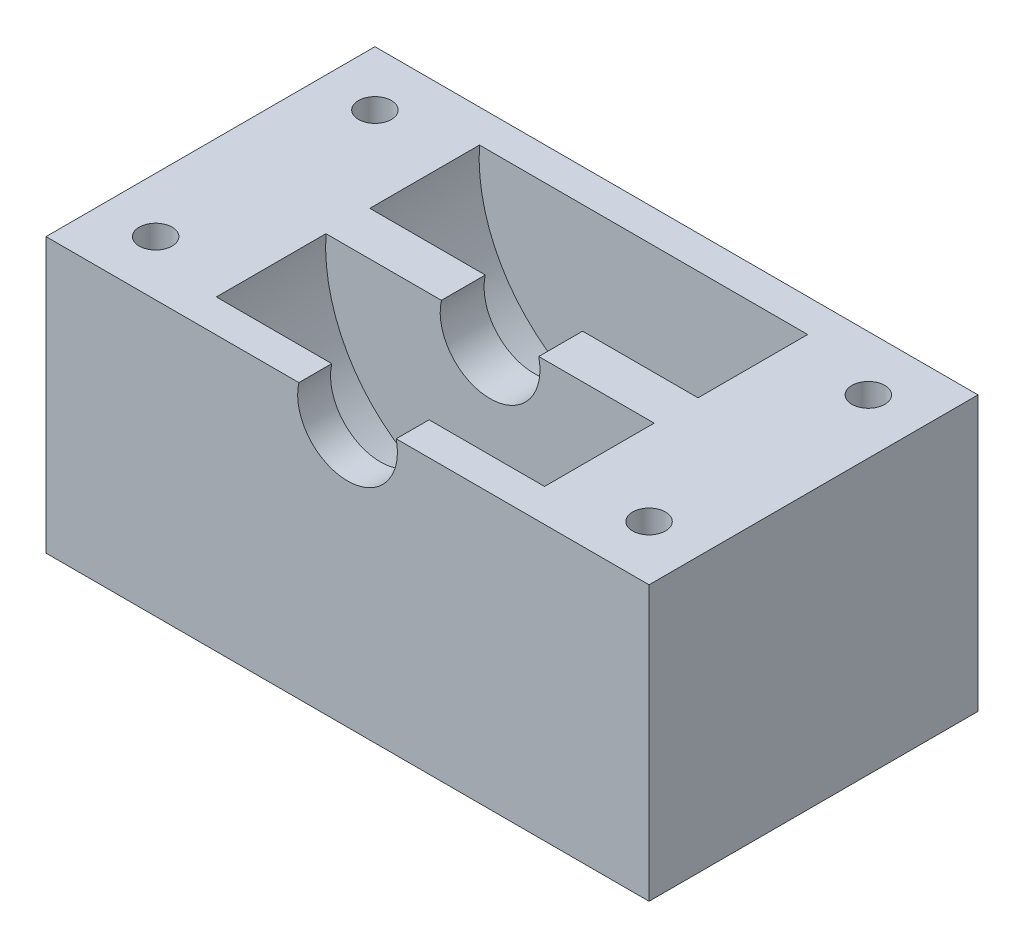
ISO-10303-21;
HEADER;
FILE_DESCRIPTION(('STEP AP214'),'2;1');
FILE_NAME('part.step','',(''),(''),'','','');
FILE_SCHEMA(('AUTOMOTIVE_DESIGN { 1 0 10303 214 1 1 1 1 }'));
ENDSEC;
DATA;
#1=APPLICATION_CONTEXT('core data for automotive mechanical design processes');
#2=APPLICATION_PROTOCOL_DEFINITION('international standard','automotive_design',2000,#1);
#3=PRODUCT_CONTEXT('',#1,'mechanical');
#4=PRODUCT('Part','Part','',(#3));
#5=PRODUCT_RELATED_PRODUCT_CATEGORY('part','',(#4));
#6=PRODUCT_DEFINITION_FORMATION('','',#4);
#7=PRODUCT_DEFINITION_CONTEXT('part definition',#1,'design');
#8=PRODUCT_DEFINITION('design','',#6,#7);
#9=PRODUCT_DEFINITION_SHAPE('','',#8);
#10=(LENGTH_UNIT() NAMED_UNIT(*) SI_UNIT(.MILLI.,.METRE.));
#11=(NAMED_UNIT(*) PLANE_ANGLE_UNIT() SI_UNIT($,.RADIAN.));
#12=(NAMED_UNIT(*) SI_UNIT($,.STERADIAN.) SOLID_ANGLE_UNIT());
#13=UNCERTAINTY_MEASURE_WITH_UNIT(LENGTH_MEASURE(1.E-05),#10,'distance_accuracy_value','');
#14=(GEOMETRIC_REPRESENTATION_CONTEXT(3) GLOBAL_UNCERTAINTY_ASSIGNED_CONTEXT((#13)) GLOBAL_UNIT_ASSIGNED_CONTEXT((#10,
#11,#12)) REPRESENTATION_CONTEXT('',''));
#15=CARTESIAN_POINT('',(0.,0.,0.));
#16=DIRECTION('',(0.,0.,1.));
#17=DIRECTION('',(1.,0.,0.));
#18=AXIS2_PLACEMENT_3D('',#15,#16,#17);
#19=CARTESIAN_POINT('',(-22.5,-17.5,15.));
#20=DIRECTION('',(0.,1.,0.));
#21=DIRECTION('',(0.,0.,-1.));
#22=AXIS2_PLACEMENT_3D('',#19,#20,#21);
#23=CYLINDRICAL_SURFACE('',#22,1.5);
#24=CARTESIAN_POINT('',(-22.5,0.999999999999994,15.));
#25=DIRECTION('',(0.,1.,0.));
#26=DIRECTION('',(0.,0.,1.));
#27=AXIS2_PLACEMENT_3D('',#24,#25,#26);
#28=CIRCLE('',#27,1.5);
#29=CARTESIAN_POINT('',(-22.5,0.999999999999994,16.5));
#30=VERTEX_POINT('',#29);
#31=EDGE_CURVE('E161',#30,#30,#28,.F.);
#32=ORIENTED_EDGE('',*,*,#31,.F.);
#33=EDGE_LOOP('',(#32));
#34=FACE_BOUND('',#33,.T.);
#35=CARTESIAN_POINT('',(-22.5,-4.,15.));
#36=DIRECTION('',(0.,1.,0.));
#37=DIRECTION('',(0.,0.,1.));
#38=AXIS2_PLACEMENT_3D('',#35,#36,#37);
#39=CIRCLE('',#38,1.5);
#40=CARTESIAN_POINT('',(-22.5,-4.,16.5));
#41=VERTEX_POINT('',#40);
#42=EDGE_CURVE('E43',#41,#41,#39,.F.);
#43=ORIENTED_EDGE('',*,*,#42,.T.);
#44=EDGE_LOOP('',(#43));
#45=FACE_BOUND('',#44,.T.);
#46=ADVANCED_FACE('F39',(#34,#45),#23,.F.);
#47=CARTESIAN_POINT('',(-22.5,-17.5,-5.));
#48=DIRECTION('',(0.,1.,0.));
#49=DIRECTION('',(0.,0.,-1.));
#50=AXIS2_PLACEMENT_3D('',#47,#48,#49);
#51=CYLINDRICAL_SURFACE('',#50,1.5);
#52=CARTESIAN_POINT('',(-22.5,0.999999999999994,-5.));
#53=DIRECTION('',(0.,1.,0.));
#54=DIRECTION('',(0.,0.,1.));
#55=AXIS2_PLACEMENT_3D('',#52,#53,#54);
#56=CIRCLE('',#55,1.5);
#57=CARTESIAN_POINT('',(-22.5,0.999999999999994,-3.5));
#58=VERTEX_POINT('',#57);
#59=EDGE_CURVE('E158',#58,#58,#56,.F.);
#60=ORIENTED_EDGE('',*,*,#59,.F.);
#61=EDGE_LOOP('',(#60));
#62=FACE_BOUND('',#61,.T.);
#63=CARTESIAN_POINT('',(-22.5,-4.,-5.));
#64=DIRECTION('',(0.,1.,0.));
#65=DIRECTION('',(0.,0.,1.));
#66=AXIS2_PLACEMENT_3D('',#63,#64,#65);
#67=CIRCLE('',#66,1.5);
#68=CARTESIAN_POINT('',(-22.5,-4.,-3.5));
#69=VERTEX_POINT('',#68);
#70=EDGE_CURVE('E239',#69,#69,#67,.F.);
#71=ORIENTED_EDGE('',*,*,#70,.T.);
#72=EDGE_LOOP('',(#71));
#73=FACE_BOUND('',#72,.T.);
#74=ADVANCED_FACE('F265',(#62,#73),#51,.F.);
#75=CARTESIAN_POINT('',(22.5,-17.5,-5.));
#76=DIRECTION('',(0.,1.,0.));
#77=DIRECTION('',(0.,0.,-1.));
#78=AXIS2_PLACEMENT_3D('',#75,#76,#77);
#79=CYLINDRICAL_SURFACE('',#78,1.5);
#80=CARTESIAN_POINT('',(22.5,0.999999999999994,-5.));
#81=DIRECTION('',(0.,1.,0.));
#82=DIRECTION('',(0.,0.,1.));
#83=AXIS2_PLACEMENT_3D('',#80,#81,#82);
#84=CIRCLE('',#83,1.5);
#85=CARTESIAN_POINT('',(22.5,0.999999999999994,-3.5));
#86=VERTEX_POINT('',#85);
#87=EDGE_CURVE('E155',#86,#86,#84,.F.);
#88=ORIENTED_EDGE('',*,*,#87,.F.);
#89=EDGE_LOOP('',(#88));
#90=FACE_BOUND('',#89,.T.);
#91=CARTESIAN_POINT('',(22.5,-4.,-5.));
#92=DIRECTION('',(0.,1.,0.));
#93=DIRECTION('',(0.,0.,1.));
#94=AXIS2_PLACEMENT_3D('',#91,#92,#93);
#95=CIRCLE('',#94,1.5);
#96=CARTESIAN_POINT('',(22.5,-4.,-3.5));
#97=VERTEX_POINT('',#96);
#98=EDGE_CURVE('E236',#97,#97,#95,.F.);
#99=ORIENTED_EDGE('',*,*,#98,.T.);
#100=EDGE_LOOP('',(#99));
#101=FACE_BOUND('',#100,.T.);
#102=ADVANCED_FACE('F271',(#90,#101),#79,.F.);
#103=CARTESIAN_POINT('',(22.5,-17.5,15.));
#104=DIRECTION('',(0.,1.,0.));
#105=DIRECTION('',(0.,0.,-1.));
#106=AXIS2_PLACEMENT_3D('',#103,#104,#105);
#107=CYLINDRICAL_SURFACE('',#106,1.5);
#108=CARTESIAN_POINT('',(22.5,0.999999999999994,15.));
#109=DIRECTION('',(0.,1.,0.));
#110=DIRECTION('',(0.,0.,1.));
#111=AXIS2_PLACEMENT_3D('',#108,#109,#110);
#112=CIRCLE('',#111,1.5);
#113=CARTESIAN_POINT('',(22.5,0.999999999999994,16.5));
#114=VERTEX_POINT('',#113);
#115=EDGE_CURVE('E152',#114,#114,#112,.F.);
#116=ORIENTED_EDGE('',*,*,#115,.F.);
#117=EDGE_LOOP('',(#116));
#118=FACE_BOUND('',#117,.T.);
#119=CARTESIAN_POINT('',(22.5,-4.,15.));
#120=DIRECTION('',(0.,1.,0.));
#121=DIRECTION('',(0.,0.,1.));
#122=AXIS2_PLACEMENT_3D('',#119,#120,#121);
#123=CIRCLE('',#122,1.5);
#124=CARTESIAN_POINT('',(22.5,-4.,16.5));
#125=VERTEX_POINT('',#124);
#126=EDGE_CURVE('E233',#125,#125,#123,.F.);
#127=ORIENTED_EDGE('',*,*,#126,.T.);
#128=EDGE_LOOP('',(#127));
#129=FACE_BOUND('',#128,.T.);
#130=ADVANCED_FACE('F277',(#118,#129),#107,.F.);
#131=CARTESIAN_POINT('',(0.,0.,-10.));
#132=DIRECTION('',(0.,0.,1.));
#133=DIRECTION('',(-1.,0.,0.));
#134=AXIS2_PLACEMENT_3D('',#131,#132,#133);
#135=CYLINDRICAL_SURFACE('',#134,15.);
#136=DIRECTION('',(0.,0.,1.));
#137=VECTOR('',#136,1.);
#138=CARTESIAN_POINT('',(-14.9666295470958,0.999999999999994,-10.));
#139=LINE('',#138,#137);
#140=CARTESIAN_POINT('',(-14.9666295470958,0.999999999999994,-7.));
#141=VERTEX_POINT('',#140);
#142=CARTESIAN_POINT('',(-14.9666295470958,0.999999999999994,3.));
#143=VERTEX_POINT('',#142);
#144=EDGE_CURVE('E187',#141,#143,#139,.T.);
#145=ORIENTED_EDGE('',*,*,#144,.T.);
#146=CARTESIAN_POINT('',(0.,0.,3.));
#147=DIRECTION('',(0.,0.,1.));
#148=DIRECTION('',(1.,0.,0.));
#149=AXIS2_PLACEMENT_3D('',#146,#147,#148);
#150=CIRCLE('',#149,15.);
#151=CARTESIAN_POINT('',(14.9666295470958,0.999999999999994,3.));
#152=VERTEX_POINT('',#151);
#153=EDGE_CURVE('E215',#143,#152,#150,.T.);
#154=ORIENTED_EDGE('',*,*,#153,.T.);
#155=DIRECTION('',(0.,0.,1.));
#156=VECTOR('',#155,1.);
#157=CARTESIAN_POINT('',(14.9666295470958,0.999999999999994,-10.));
#158=LINE('',#157,#156);
#159=CARTESIAN_POINT('',(14.9666295470958,0.999999999999994,-7.));
#160=VERTEX_POINT('',#159);
#161=EDGE_CURVE('E181',#152,#160,#158,.F.);
#162=ORIENTED_EDGE('',*,*,#161,.T.);
#163=CARTESIAN_POINT('',(0.,0.,-7.));
#164=DIRECTION('',(0.,0.,1.));
#165=DIRECTION('',(1.,0.,0.));
#166=AXIS2_PLACEMENT_3D('',#163,#164,#165);
#167=CIRCLE('',#166,15.);
#168=EDGE_CURVE('E202',#141,#160,#167,.T.);
#169=ORIENTED_EDGE('',*,*,#168,.F.);
#170=EDGE_LOOP('',(#145,#154,#162,#169));
#171=FACE_BOUND('',#170,.T.);
#172=ADVANCED_FACE('F286',(#171),#135,.F.);
#173=CARTESIAN_POINT('',(0.,0.,20.));
#174=DIRECTION('',(0.,0.,-1.));
#175=DIRECTION('',(1.,0.,0.));
#176=AXIS2_PLACEMENT_3D('',#173,#174,#175);
#177=CYLINDRICAL_SURFACE('',#176,15.);
#178=DIRECTION('',(0.,0.,-1.));
#179=VECTOR('',#178,1.);
#180=CARTESIAN_POINT('',(14.9666295470958,0.999999999999994,20.));
#181=LINE('',#180,#179);
#182=CARTESIAN_POINT('',(14.9666295470958,0.999999999999994,17.));
#183=VERTEX_POINT('',#182);
#184=CARTESIAN_POINT('',(14.9666295470958,0.999999999999994,7.));
#185=VERTEX_POINT('',#184);
#186=EDGE_CURVE('E169',#183,#185,#181,.T.);
#187=ORIENTED_EDGE('',*,*,#186,.T.);
#188=CARTESIAN_POINT('',(0.,0.,7.));
#189=DIRECTION('',(0.,0.,-1.));
#190=DIRECTION('',(-1.,0.,0.));
#191=AXIS2_PLACEMENT_3D('',#188,#189,#190);
#192=CIRCLE('',#191,15.);
#193=CARTESIAN_POINT('',(-14.9666295470958,0.999999999999994,7.));
#194=VERTEX_POINT('',#193);
#195=EDGE_CURVE('E219',#185,#194,#192,.T.);
#196=ORIENTED_EDGE('',*,*,#195,.T.);
#197=DIRECTION('',(0.,0.,-1.));
#198=VECTOR('',#197,1.);
#199=CARTESIAN_POINT('',(-14.9666295470958,0.999999999999994,20.));
#200=LINE('',#199,#198);
#201=CARTESIAN_POINT('',(-14.9666295470958,0.999999999999994,17.));
#202=VERTEX_POINT('',#201);
#203=EDGE_CURVE('E193',#194,#202,#200,.F.);
#204=ORIENTED_EDGE('',*,*,#203,.T.);
#205=CARTESIAN_POINT('',(0.,0.,17.));
#206=DIRECTION('',(0.,0.,-1.));
#207=DIRECTION('',(-1.,0.,0.));
#208=AXIS2_PLACEMENT_3D('',#205,#206,#207);
#209=CIRCLE('',#208,15.);
#210=EDGE_CURVE('E205',#183,#202,#209,.T.);
#211=ORIENTED_EDGE('',*,*,#210,.F.);
#212=EDGE_LOOP('',(#187,#196,#204,#211));
#213=FACE_BOUND('',#212,.T.);
#214=ADVANCED_FACE('F282',(#213),#177,.F.);
#215=CARTESIAN_POINT('',(0.,0.,20.));
#216=DIRECTION('',(0.,0.,-1.));
#217=DIRECTION('',(1.,0.,0.));
#218=AXIS2_PLACEMENT_3D('',#215,#216,#217);
#219=CYLINDRICAL_SURFACE('',#218,4.55);
#220=CARTESIAN_POINT('',(0.,0.,3.));
#221=DIRECTION('',(0.,0.,1.));
#222=DIRECTION('',(1.,0.,0.));
#223=AXIS2_PLACEMENT_3D('',#220,#221,#222);
#224=CIRCLE('',#223,4.55);
#225=CARTESIAN_POINT('',(4.43874982399324,0.999999999999994,3.));
#226=VERTEX_POINT('',#225);
#227=CARTESIAN_POINT('',(-4.43874982399324,0.999999999999994,3.));
#228=VERTEX_POINT('',#227);
#229=EDGE_CURVE('E218',#226,#228,#224,.F.);
#230=ORIENTED_EDGE('',*,*,#229,.T.);
#231=DIRECTION('',(0.,0.,-1.));
#232=VECTOR('',#231,1.);
#233=CARTESIAN_POINT('',(-4.43874982399324,0.999999999999994,20.));
#234=LINE('',#233,#232);
#235=CARTESIAN_POINT('',(-4.43874982399324,0.999999999999994,7.));
#236=VERTEX_POINT('',#235);
#237=EDGE_CURVE('E190',#236,#228,#234,.T.);
#238=ORIENTED_EDGE('',*,*,#237,.F.);
#239=CARTESIAN_POINT('',(0.,0.,7.));
#240=DIRECTION('',(0.,0.,-1.));
#241=DIRECTION('',(-1.,0.,0.));
#242=AXIS2_PLACEMENT_3D('',#239,#240,#241);
#243=CIRCLE('',#242,4.55);
#244=CARTESIAN_POINT('',(4.43874982399324,0.999999999999994,7.));
#245=VERTEX_POINT('',#244);
#246=EDGE_CURVE('E222',#236,#245,#243,.F.);
#247=ORIENTED_EDGE('',*,*,#246,.T.);
#248=DIRECTION('',(0.,0.,-1.));
#249=VECTOR('',#248,1.);
#250=CARTESIAN_POINT('',(4.43874982399324,0.999999999999994,20.));
#251=LINE('',#250,#249);
#252=EDGE_CURVE('E175',#226,#245,#251,.F.);
#253=ORIENTED_EDGE('',*,*,#252,.F.);
#254=EDGE_LOOP('',(#230,#238,#247,#253));
#255=FACE_BOUND('',#254,.T.);
#256=ADVANCED_FACE('F278',(#255),#219,.F.);
#257=CARTESIAN_POINT('',(0.,0.,7.));
#258=DIRECTION('',(0.,0.,1.));
#259=DIRECTION('',(-1.,0.,0.));
#260=AXIS2_PLACEMENT_3D('',#257,#258,#259);
#261=PLANE('',#260);
#262=DIRECTION('',(-1.,0.,0.));
#263=VECTOR('',#262,1.);
#264=CARTESIAN_POINT('',(0.,0.999999999999994,7.));
#265=LINE('',#264,#263);
#266=EDGE_CURVE('E173',#185,#245,#265,.T.);
#267=ORIENTED_EDGE('',*,*,#266,.T.);
#268=ORIENTED_EDGE('',*,*,#246,.F.);
#269=EDGE_CURVE('E176',#236,#194,#265,.T.);
#270=ORIENTED_EDGE('',*,*,#269,.T.);
#271=ORIENTED_EDGE('',*,*,#195,.F.);
#272=EDGE_LOOP('',(#267,#268,#270,#271));
#273=FACE_BOUND('',#272,.T.);
#274=ADVANCED_FACE('F281',(#273),#261,.T.);
#275=CARTESIAN_POINT('',(0.,0.,3.));
#276=DIRECTION('',(0.,0.,-1.));
#277=DIRECTION('',(1.,0.,0.));
#278=AXIS2_PLACEMENT_3D('',#275,#276,#277);
#279=PLANE('',#278);
#280=DIRECTION('',(1.,0.,0.));
#281=VECTOR('',#280,1.);
#282=CARTESIAN_POINT('',(0.,0.999999999999994,3.));
#283=LINE('',#282,#281);
#284=EDGE_CURVE('E182',#143,#228,#283,.T.);
#285=ORIENTED_EDGE('',*,*,#284,.T.);
#286=ORIENTED_EDGE('',*,*,#229,.F.);
#287=EDGE_CURVE('E179',#226,#152,#283,.T.);
#288=ORIENTED_EDGE('',*,*,#287,.T.);
#289=ORIENTED_EDGE('',*,*,#153,.F.);
#290=EDGE_LOOP('',(#285,#286,#288,#289));
#291=FACE_BOUND('',#290,.T.);
#292=ADVANCED_FACE('F327',(#291),#279,.T.);
#293=CARTESIAN_POINT('',(0.,0.,17.));
#294=DIRECTION('',(0.,0.,1.));
#295=DIRECTION('',(-1.,0.,0.));
#296=AXIS2_PLACEMENT_3D('',#293,#294,#295);
#297=PLANE('',#296);
#298=ORIENTED_EDGE('',*,*,#210,.T.);
#299=DIRECTION('',(-1.,0.,0.));
#300=VECTOR('',#299,1.);
#301=CARTESIAN_POINT('',(0.,0.999999999999994,17.));
#302=LINE('',#301,#300);
#303=CARTESIAN_POINT('',(-4.43874982399324,0.999999999999994,17.));
#304=VERTEX_POINT('',#303);
#305=EDGE_CURVE('E170',#304,#202,#302,.T.);
#306=ORIENTED_EDGE('',*,*,#305,.F.);
#307=CARTESIAN_POINT('',(0.,0.,17.));
#308=DIRECTION('',(0.,0.,-1.));
#309=DIRECTION('',(-1.,0.,0.));
#310=AXIS2_PLACEMENT_3D('',#307,#308,#309);
#311=CIRCLE('',#310,4.55);
#312=CARTESIAN_POINT('',(4.43874982399324,0.999999999999994,17.));
#313=VERTEX_POINT('',#312);
#314=EDGE_CURVE('E201',#313,#304,#311,.T.);
#315=ORIENTED_EDGE('',*,*,#314,.F.);
#316=EDGE_CURVE('E166',#183,#313,#302,.T.);
#317=ORIENTED_EDGE('',*,*,#316,.F.);
#318=EDGE_LOOP('',(#298,#306,#315,#317));
#319=FACE_BOUND('',#318,.T.);
#320=ADVANCED_FACE('F314',(#319),#297,.F.);
#321=CARTESIAN_POINT('',(0.,0.,-7.));
#322=DIRECTION('',(0.,0.,-1.));
#323=DIRECTION('',(1.,0.,0.));
#324=AXIS2_PLACEMENT_3D('',#321,#322,#323);
#325=PLANE('',#324);
#326=ORIENTED_EDGE('',*,*,#168,.T.);
#327=DIRECTION('',(1.,0.,0.));
#328=VECTOR('',#327,1.);
#329=CARTESIAN_POINT('',(0.,0.999999999999994,-7.));
#330=LINE('',#329,#328);
#331=EDGE_CURVE('E185',#141,#160,#330,.T.);
#332=ORIENTED_EDGE('',*,*,#331,.F.);
#333=EDGE_LOOP('',(#326,#332));
#334=FACE_BOUND('',#333,.T.);
#335=ADVANCED_FACE('F331',(#334),#325,.F.);
#336=CARTESIAN_POINT('',(0.,0.,0.));
#337=DIRECTION('',(0.,0.,1.));
#338=DIRECTION('',(-1.,0.,0.));
#339=AXIS2_PLACEMENT_3D('',#336,#337,#338);
#340=CYLINDRICAL_SURFACE('',#339,4.55);
#341=CARTESIAN_POINT('',(0.,0.,20.));
#342=DIRECTION('',(0.,0.,-1.));
#343=DIRECTION('',(-1.,0.,0.));
#344=AXIS2_PLACEMENT_3D('',#341,#342,#343);
#345=CIRCLE('',#344,4.55);
#346=CARTESIAN_POINT('',(4.43874982399324,0.999999999999994,20.));
#347=VERTEX_POINT('',#346);
#348=CARTESIAN_POINT('',(-4.43874982399324,0.999999999999994,20.));
#349=VERTEX_POINT('',#348);
#350=EDGE_CURVE('E198',#347,#349,#345,.T.);
#351=ORIENTED_EDGE('',*,*,#350,.F.);
#352=DIRECTION('',(0.,0.,1.));
#353=VECTOR('',#352,1.);
#354=CARTESIAN_POINT('',(4.43874982399324,0.999999999999994,0.));
#355=LINE('',#354,#353);
#356=EDGE_CURVE('E164',#313,#347,#355,.T.);
#357=ORIENTED_EDGE('',*,*,#356,.F.);
#358=ORIENTED_EDGE('',*,*,#314,.T.);
#359=DIRECTION('',(0.,0.,1.));
#360=VECTOR('',#359,1.);
#361=CARTESIAN_POINT('',(-4.43874982399324,0.999999999999994,0.));
#362=LINE('',#361,#360);
#363=EDGE_CURVE('E196',#349,#304,#362,.F.);
#364=ORIENTED_EDGE('',*,*,#363,.F.);
#365=EDGE_LOOP('',(#351,#357,#358,#364));
#366=FACE_BOUND('',#365,.T.);
#367=ADVANCED_FACE('F291',(#366),#340,.F.);
#368=CARTESIAN_POINT('',(0.,0.,20.));
#369=DIRECTION('',(0.,0.,1.));
#370=DIRECTION('',(-1.,0.,0.));
#371=AXIS2_PLACEMENT_3D('',#368,#369,#370);
#372=PLANE('',#371);
#373=DIRECTION('',(-1.,0.,0.));
#374=VECTOR('',#373,1.);
#375=CARTESIAN_POINT('',(-27.5,0.999999999999994,20.));
#376=LINE('',#375,#374);
#377=CARTESIAN_POINT('',(27.5,0.999999999999994,20.));
#378=VERTEX_POINT('',#377);
#379=EDGE_CURVE('E143',#378,#347,#376,.T.);
#380=ORIENTED_EDGE('',*,*,#379,.T.);
#381=ORIENTED_EDGE('',*,*,#350,.T.);
#382=CARTESIAN_POINT('',(-27.5,0.999999999999994,20.));
#383=VERTEX_POINT('',#382);
#384=EDGE_CURVE('E144',#349,#383,#376,.T.);
#385=ORIENTED_EDGE('',*,*,#384,.T.);
#386=DIRECTION('',(0.,1.,0.));
#387=VECTOR('',#386,1.);
#388=CARTESIAN_POINT('',(-27.5,21.,20.));
#389=LINE('',#388,#387);
#390=CARTESIAN_POINT('',(-27.5,-24.,20.));
#391=VERTEX_POINT('',#390);
#392=EDGE_CURVE('E223',#391,#383,#389,.T.);
#393=ORIENTED_EDGE('',*,*,#392,.F.);
#394=DIRECTION('',(1.,0.,0.));
#395=VECTOR('',#394,1.);
#396=CARTESIAN_POINT('',(17.5,-24.,20.));
#397=LINE('',#396,#395);
#398=CARTESIAN_POINT('',(27.5,-24.,20.));
#399=VERTEX_POINT('',#398);
#400=EDGE_CURVE('E211',#391,#399,#397,.T.);
#401=ORIENTED_EDGE('',*,*,#400,.T.);
#402=DIRECTION('',(0.,-1.,0.));
#403=VECTOR('',#402,1.);
#404=CARTESIAN_POINT('',(27.5,26.,20.));
#405=LINE('',#404,#403);
#406=EDGE_CURVE('E138',#378,#399,#405,.T.);
#407=ORIENTED_EDGE('',*,*,#406,.F.);
#408=EDGE_LOOP('',(#380,#381,#385,#393,#401,#407));
#409=FACE_BOUND('',#408,.T.);
#410=ADVANCED_FACE('F288',(#409),#372,.T.);
#411=CARTESIAN_POINT('',(27.5,0.,-10.));
#412=DIRECTION('',(1.,0.,0.));
#413=DIRECTION('',(0.,0.,1.));
#414=AXIS2_PLACEMENT_3D('',#411,#412,#413);
#415=PLANE('',#414);
#416=DIRECTION('',(0.,0.,1.));
#417=VECTOR('',#416,1.);
#418=CARTESIAN_POINT('',(27.5,0.999999999999994,-10.));
#419=LINE('',#418,#417);
#420=CARTESIAN_POINT('',(27.5,0.999999999999994,-10.));
#421=VERTEX_POINT('',#420);
#422=EDGE_CURVE('E132',#421,#378,#419,.T.);
#423=ORIENTED_EDGE('',*,*,#422,.T.);
#424=ORIENTED_EDGE('',*,*,#406,.T.);
#425=DIRECTION('',(0.,0.,-1.));
#426=VECTOR('',#425,1.);
#427=CARTESIAN_POINT('',(27.5,-24.,20.));
#428=LINE('',#427,#426);
#429=CARTESIAN_POINT('',(27.5,-24.,-10.));
#430=VERTEX_POINT('',#429);
#431=EDGE_CURVE('E137',#399,#430,#428,.T.);
#432=ORIENTED_EDGE('',*,*,#431,.T.);
#433=DIRECTION('',(0.,-1.,0.));
#434=VECTOR('',#433,1.);
#435=CARTESIAN_POINT('',(27.5,0.,-10.));
#436=LINE('',#435,#434);
#437=EDGE_CURVE('E48',#421,#430,#436,.T.);
#438=ORIENTED_EDGE('',*,*,#437,.F.);
#439=EDGE_LOOP('',(#423,#424,#432,#438));
#440=FACE_BOUND('',#439,.T.);
#441=ADVANCED_FACE('F41',(#440),#415,.T.);
#442=CARTESIAN_POINT('',(0.,-24.,0.));
#443=DIRECTION('',(0.,-1.,0.));
#444=DIRECTION('',(0.,0.,1.));
#445=AXIS2_PLACEMENT_3D('',#442,#443,#444);
#446=PLANE('',#445);
#447=CARTESIAN_POINT('',(-22.5,-24.,15.));
#448=DIRECTION('',(0.,1.,0.));
#449=DIRECTION('',(0.,0.,1.));
#450=AXIS2_PLACEMENT_3D('',#447,#448,#449);
#451=CIRCLE('',#450,3.);
#452=CARTESIAN_POINT('',(-22.5,-24.,18.));
#453=VERTEX_POINT('',#452);
#454=EDGE_CURVE('E407',#453,#453,#451,.T.);
#455=ORIENTED_EDGE('',*,*,#454,.T.);
#456=EDGE_LOOP('',(#455));
#457=FACE_BOUND('',#456,.T.);
#458=CARTESIAN_POINT('',(22.5,-24.,-5.));
#459=DIRECTION('',(0.,1.,0.));
#460=DIRECTION('',(0.,0.,1.));
#461=AXIS2_PLACEMENT_3D('',#458,#459,#460);
#462=CIRCLE('',#461,3.);
#463=CARTESIAN_POINT('',(22.5,-24.,-2.));
#464=VERTEX_POINT('',#463);
#465=EDGE_CURVE('E394',#464,#464,#462,.T.);
#466=ORIENTED_EDGE('',*,*,#465,.T.);
#467=EDGE_LOOP('',(#466));
#468=FACE_BOUND('',#467,.T.);
#469=CARTESIAN_POINT('',(22.5,-24.,15.));
#470=DIRECTION('',(0.,1.,0.));
#471=DIRECTION('',(0.,0.,1.));
#472=AXIS2_PLACEMENT_3D('',#469,#470,#471);
#473=CIRCLE('',#472,3.);
#474=CARTESIAN_POINT('',(22.5,-24.,18.));
#475=VERTEX_POINT('',#474);
#476=EDGE_CURVE('E395',#475,#475,#473,.T.);
#477=ORIENTED_EDGE('',*,*,#476,.T.);
#478=EDGE_LOOP('',(#477));
#479=FACE_BOUND('',#478,.T.);
#480=CARTESIAN_POINT('',(-22.5,-24.,-5.));
#481=DIRECTION('',(0.,1.,0.));
#482=DIRECTION('',(0.,0.,1.));
#483=AXIS2_PLACEMENT_3D('',#480,#481,#482);
#484=CIRCLE('',#483,3.);
#485=CARTESIAN_POINT('',(-22.5,-24.,-2.));
#486=VERTEX_POINT('',#485);
#487=EDGE_CURVE('E406',#486,#486,#484,.T.);
#488=ORIENTED_EDGE('',*,*,#487,.T.);
#489=EDGE_LOOP('',(#488));
#490=FACE_BOUND('',#489,.T.);
#491=DIRECTION('',(-1.,0.,0.));
#492=VECTOR('',#491,1.);
#493=CARTESIAN_POINT('',(27.5,-24.,-10.));
#494=LINE('',#493,#492);
#495=CARTESIAN_POINT('',(-27.5,-24.,-10.));
#496=VERTEX_POINT('',#495);
#497=EDGE_CURVE('E64',#430,#496,#494,.T.);
#498=ORIENTED_EDGE('',*,*,#497,.F.);
#499=ORIENTED_EDGE('',*,*,#431,.F.);
#500=ORIENTED_EDGE('',*,*,#400,.F.);
#501=DIRECTION('',(0.,0.,1.));
#502=VECTOR('',#501,1.);
#503=CARTESIAN_POINT('',(-27.5,-24.,-10.));
#504=LINE('',#503,#502);
#505=EDGE_CURVE('E208',#496,#391,#504,.T.);
#506=ORIENTED_EDGE('',*,*,#505,.F.);
#507=EDGE_LOOP('',(#498,#499,#500,#506));
#508=FACE_BOUND('',#507,.T.);
#509=ADVANCED_FACE('F299',(#457,#468,#479,#490,#508),#446,.T.);
#510=CARTESIAN_POINT('',(-27.5,0.,-10.));
#511=DIRECTION('',(1.,0.,0.));
#512=DIRECTION('',(0.,0.,1.));
#513=AXIS2_PLACEMENT_3D('',#510,#511,#512);
#514=PLANE('',#513);
#515=DIRECTION('',(0.,-1.,0.));
#516=VECTOR('',#515,1.);
#517=CARTESIAN_POINT('',(-27.5,0.,-10.));
#518=LINE('',#517,#516);
#519=CARTESIAN_POINT('',(-27.5,0.999999999999994,-10.));
#520=VERTEX_POINT('',#519);
#521=EDGE_CURVE('E11',#520,#496,#518,.T.);
#522=ORIENTED_EDGE('',*,*,#521,.T.);
#523=ORIENTED_EDGE('',*,*,#505,.T.);
#524=ORIENTED_EDGE('',*,*,#392,.T.);
#525=DIRECTION('',(0.,0.,-1.));
#526=VECTOR('',#525,1.);
#527=CARTESIAN_POINT('',(-27.5,0.999999999999994,-10.));
#528=LINE('',#527,#526);
#529=EDGE_CURVE('E150',#383,#520,#528,.T.);
#530=ORIENTED_EDGE('',*,*,#529,.T.);
#531=EDGE_LOOP('',(#522,#523,#524,#530));
#532=FACE_BOUND('',#531,.T.);
#533=ADVANCED_FACE('F295',(#532),#514,.F.);
#534=CARTESIAN_POINT('',(0.,0.,-10.));
#535=DIRECTION('',(0.,0.,-1.));
#536=DIRECTION('',(1.,0.,0.));
#537=AXIS2_PLACEMENT_3D('',#534,#535,#536);
#538=PLANE('',#537);
#539=DIRECTION('',(1.,0.,0.));
#540=VECTOR('',#539,1.);
#541=CARTESIAN_POINT('',(27.5,0.999999999999994,-10.));
#542=LINE('',#541,#540);
#543=EDGE_CURVE('E56',#520,#421,#542,.T.);
#544=ORIENTED_EDGE('',*,*,#543,.T.);
#545=ORIENTED_EDGE('',*,*,#437,.T.);
#546=ORIENTED_EDGE('',*,*,#497,.T.);
#547=ORIENTED_EDGE('',*,*,#521,.F.);
#548=EDGE_LOOP('',(#544,#545,#546,#547));
#549=FACE_BOUND('',#548,.T.);
#550=ADVANCED_FACE('F130',(#549),#538,.T.);
#551=CARTESIAN_POINT('',(0.,0.999999999999994,0.));
#552=DIRECTION('',(0.,-1.,0.));
#553=DIRECTION('',(0.,0.,1.));
#554=AXIS2_PLACEMENT_3D('',#551,#552,#553);
#555=PLANE('',#554);
#556=ORIENTED_EDGE('',*,*,#59,.T.);
#557=EDGE_LOOP('',(#556));
#558=FACE_BOUND('',#557,.T.);
#559=ORIENTED_EDGE('',*,*,#115,.T.);
#560=EDGE_LOOP('',(#559));
#561=FACE_BOUND('',#560,.T.);
#562=ORIENTED_EDGE('',*,*,#87,.T.);
#563=EDGE_LOOP('',(#562));
#564=FACE_BOUND('',#563,.T.);
#565=ORIENTED_EDGE('',*,*,#31,.T.);
#566=EDGE_LOOP('',(#565));
#567=FACE_BOUND('',#566,.T.);
#568=ORIENTED_EDGE('',*,*,#384,.F.);
#569=ORIENTED_EDGE('',*,*,#363,.T.);
#570=ORIENTED_EDGE('',*,*,#305,.T.);
#571=ORIENTED_EDGE('',*,*,#203,.F.);
#572=ORIENTED_EDGE('',*,*,#269,.F.);
#573=ORIENTED_EDGE('',*,*,#237,.T.);
#574=ORIENTED_EDGE('',*,*,#284,.F.);
#575=ORIENTED_EDGE('',*,*,#144,.F.);
#576=ORIENTED_EDGE('',*,*,#331,.T.);
#577=ORIENTED_EDGE('',*,*,#161,.F.);
#578=ORIENTED_EDGE('',*,*,#287,.F.);
#579=ORIENTED_EDGE('',*,*,#252,.T.);
#580=ORIENTED_EDGE('',*,*,#266,.F.);
#581=ORIENTED_EDGE('',*,*,#186,.F.);
#582=ORIENTED_EDGE('',*,*,#316,.T.);
#583=ORIENTED_EDGE('',*,*,#356,.T.);
#584=ORIENTED_EDGE('',*,*,#379,.F.);
#585=ORIENTED_EDGE('',*,*,#422,.F.);
#586=ORIENTED_EDGE('',*,*,#543,.F.);
#587=ORIENTED_EDGE('',*,*,#529,.F.);
#588=EDGE_LOOP('',(#568,#569,#570,#571,#572,#573,#574,#575,#576,#577,#578,#579,#580,#581,#582,
#583,#584,#585,#586,#587));
#589=FACE_BOUND('',#588,.T.);
#590=ADVANCED_FACE('F141',(#558,#561,#564,#567,#589),#555,.F.);
#591=CARTESIAN_POINT('',(-22.5,-4.,-5.));
#592=DIRECTION('',(0.,-1.,0.));
#593=DIRECTION('',(0.,0.,1.));
#594=AXIS2_PLACEMENT_3D('',#591,#592,#593);
#595=PLANE('',#594);
#596=CARTESIAN_POINT('',(-22.5,-4.,-5.));
#597=DIRECTION('',(0.,1.,0.));
#598=DIRECTION('',(0.,0.,1.));
#599=AXIS2_PLACEMENT_3D('',#596,#597,#598);
#600=CIRCLE('',#599,3.);
#601=CARTESIAN_POINT('',(-22.5,-4.,-2.));
#602=VERTEX_POINT('',#601);
#603=EDGE_CURVE('E237',#602,#602,#600,.T.);
#604=ORIENTED_EDGE('',*,*,#603,.F.);
#605=EDGE_LOOP('',(#604));
#606=FACE_BOUND('',#605,.T.);
#607=ORIENTED_EDGE('',*,*,#70,.F.);
#608=EDGE_LOOP('',(#607));
#609=FACE_BOUND('',#608,.T.);
#610=ADVANCED_FACE('F367',(#606,#609),#595,.T.);
#611=CARTESIAN_POINT('',(-22.5,-4.,-5.));
#612=DIRECTION('',(0.,-1.,0.));
#613=DIRECTION('',(0.,0.,1.));
#614=AXIS2_PLACEMENT_3D('',#611,#612,#613);
#615=CYLINDRICAL_SURFACE('',#614,3.);
#616=ORIENTED_EDGE('',*,*,#603,.T.);
#617=EDGE_LOOP('',(#616));
#618=FACE_BOUND('',#617,.T.);
#619=ORIENTED_EDGE('',*,*,#487,.F.);
#620=EDGE_LOOP('',(#619));
#621=FACE_BOUND('',#620,.T.);
#622=ADVANCED_FACE('F370',(#618,#621),#615,.F.);
#623=CARTESIAN_POINT('',(22.5,-4.,15.));
#624=DIRECTION('',(0.,-1.,0.));
#625=DIRECTION('',(0.,0.,1.));
#626=AXIS2_PLACEMENT_3D('',#623,#624,#625);
#627=PLANE('',#626);
#628=CARTESIAN_POINT('',(22.5,-4.,15.));
#629=DIRECTION('',(0.,1.,0.));
#630=DIRECTION('',(0.,0.,1.));
#631=AXIS2_PLACEMENT_3D('',#628,#629,#630);
#632=CIRCLE('',#631,3.);
#633=CARTESIAN_POINT('',(22.5,-4.,18.));
#634=VERTEX_POINT('',#633);
#635=EDGE_CURVE('E393',#634,#634,#632,.T.);
#636=ORIENTED_EDGE('',*,*,#635,.F.);
#637=EDGE_LOOP('',(#636));
#638=FACE_BOUND('',#637,.T.);
#639=ORIENTED_EDGE('',*,*,#126,.F.);
#640=EDGE_LOOP('',(#639));
#641=FACE_BOUND('',#640,.T.);
#642=ADVANCED_FACE('F363',(#638,#641),#627,.T.);
#643=CARTESIAN_POINT('',(22.5,-4.,15.));
#644=DIRECTION('',(0.,-1.,0.));
#645=DIRECTION('',(0.,0.,1.));
#646=AXIS2_PLACEMENT_3D('',#643,#644,#645);
#647=CYLINDRICAL_SURFACE('',#646,3.);
#648=ORIENTED_EDGE('',*,*,#635,.T.);
#649=EDGE_LOOP('',(#648));
#650=FACE_BOUND('',#649,.T.);
#651=ORIENTED_EDGE('',*,*,#476,.F.);
#652=EDGE_LOOP('',(#651));
#653=FACE_BOUND('',#652,.T.);
#654=ADVANCED_FACE('F357',(#650,#653),#647,.F.);
#655=CARTESIAN_POINT('',(22.5,-4.,-5.));
#656=DIRECTION('',(0.,-1.,0.));
#657=DIRECTION('',(0.,0.,1.));
#658=AXIS2_PLACEMENT_3D('',#655,#656,#657);
#659=PLANE('',#658);
#660=CARTESIAN_POINT('',(22.5,-4.,-5.));
#661=DIRECTION('',(0.,1.,0.));
#662=DIRECTION('',(0.,0.,1.));
#663=AXIS2_PLACEMENT_3D('',#660,#661,#662);
#664=CIRCLE('',#663,3.);
#665=CARTESIAN_POINT('',(22.5,-4.,-2.));
#666=VERTEX_POINT('',#665);
#667=EDGE_CURVE('E398',#666,#666,#664,.T.);
#668=ORIENTED_EDGE('',*,*,#667,.F.);
#669=EDGE_LOOP('',(#668));
#670=FACE_BOUND('',#669,.T.);
#671=ORIENTED_EDGE('',*,*,#98,.F.);
#672=EDGE_LOOP('',(#671));
#673=FACE_BOUND('',#672,.T.);
#674=ADVANCED_FACE('F259',(#670,#673),#659,.T.);
#675=CARTESIAN_POINT('',(22.5,-4.,-5.));
#676=DIRECTION('',(0.,-1.,0.));
#677=DIRECTION('',(0.,0.,1.));
#678=AXIS2_PLACEMENT_3D('',#675,#676,#677);
#679=CYLINDRICAL_SURFACE('',#678,3.);
#680=ORIENTED_EDGE('',*,*,#667,.T.);
#681=EDGE_LOOP('',(#680));
#682=FACE_BOUND('',#681,.T.);
#683=ORIENTED_EDGE('',*,*,#465,.F.);
#684=EDGE_LOOP('',(#683));
#685=FACE_BOUND('',#684,.T.);
#686=ADVANCED_FACE('F250',(#682,#685),#679,.F.);
#687=CARTESIAN_POINT('',(-22.5,-4.,15.));
#688=DIRECTION('',(0.,-1.,0.));
#689=DIRECTION('',(0.,0.,1.));
#690=AXIS2_PLACEMENT_3D('',#687,#688,#689);
#691=PLANE('',#690);
#692=CARTESIAN_POINT('',(-22.5,-4.,15.));
#693=DIRECTION('',(0.,1.,0.));
#694=DIRECTION('',(0.,0.,1.));
#695=AXIS2_PLACEMENT_3D('',#692,#693,#694);
#696=CIRCLE('',#695,3.);
#697=CARTESIAN_POINT('',(-22.5,-4.,18.));
#698=VERTEX_POINT('',#697);
#699=EDGE_CURVE('E403',#698,#698,#696,.T.);
#700=ORIENTED_EDGE('',*,*,#699,.F.);
#701=EDGE_LOOP('',(#700));
#702=FACE_BOUND('',#701,.T.);
#703=ORIENTED_EDGE('',*,*,#42,.F.);
#704=EDGE_LOOP('',(#703));
#705=FACE_BOUND('',#704,.T.);
#706=ADVANCED_FACE('F247',(#702,#705),#691,.T.);
#707=CARTESIAN_POINT('',(-22.5,-4.,15.));
#708=DIRECTION('',(0.,-1.,0.));
#709=DIRECTION('',(0.,0.,1.));
#710=AXIS2_PLACEMENT_3D('',#707,#708,#709);
#711=CYLINDRICAL_SURFACE('',#710,3.);
#712=ORIENTED_EDGE('',*,*,#699,.T.);
#713=EDGE_LOOP('',(#712));
#714=FACE_BOUND('',#713,.T.);
#715=ORIENTED_EDGE('',*,*,#454,.F.);
#716=EDGE_LOOP('',(#715));
#717=FACE_BOUND('',#716,.T.);
#718=ADVANCED_FACE('F249',(#714,#717),#711,.F.);
#719=CLOSED_SHELL('',(#46,#74,#102,#130,#172,#214,#256,#274,#292,#320,#335,#367,#410,#441,#509,
#533,#550,#590,#610,#622,#642,#654,#674,#686,#706,#718));
#720=MANIFOLD_SOLID_BREP('B2',#719);
#721=ADVANCED_BREP_SHAPE_REPRESENTATION('',(#18,#720),#14);
#722=SHAPE_DEFINITION_REPRESENTATION(#9,#721);
ENDSEC;
END-ISO-10303-21;
